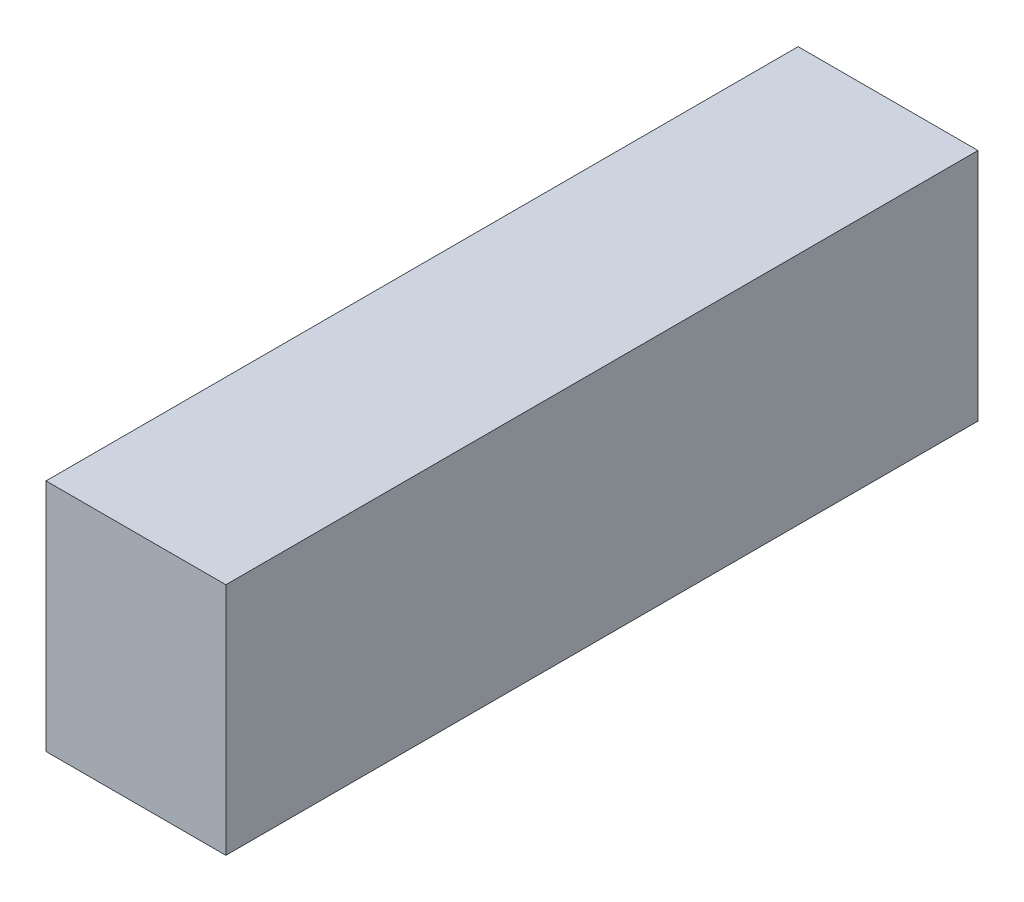
ISO-10303-21;
HEADER;
FILE_DESCRIPTION(('STEP AP214'),'2;1');
FILE_NAME('part.step','',(''),(''),'','','');
FILE_SCHEMA(('AUTOMOTIVE_DESIGN { 1 0 10303 214 1 1 1 1 }'));
ENDSEC;
DATA;
#1=APPLICATION_CONTEXT('core data for automotive mechanical design processes');
#2=APPLICATION_PROTOCOL_DEFINITION('international standard','automotive_design',2000,#1);
#3=PRODUCT_CONTEXT('',#1,'mechanical');
#4=PRODUCT('Part','Part','',(#3));
#5=PRODUCT_RELATED_PRODUCT_CATEGORY('part','',(#4));
#6=PRODUCT_DEFINITION_FORMATION('','',#4);
#7=PRODUCT_DEFINITION_CONTEXT('part definition',#1,'design');
#8=PRODUCT_DEFINITION('design','',#6,#7);
#9=PRODUCT_DEFINITION_SHAPE('','',#8);
#10=(LENGTH_UNIT() NAMED_UNIT(*) SI_UNIT(.MILLI.,.METRE.));
#11=(NAMED_UNIT(*) PLANE_ANGLE_UNIT() SI_UNIT($,.RADIAN.));
#12=(NAMED_UNIT(*) SI_UNIT($,.STERADIAN.) SOLID_ANGLE_UNIT());
#13=UNCERTAINTY_MEASURE_WITH_UNIT(LENGTH_MEASURE(1.E-05),#10,'distance_accuracy_value','');
#14=(GEOMETRIC_REPRESENTATION_CONTEXT(3) GLOBAL_UNCERTAINTY_ASSIGNED_CONTEXT((#13)) GLOBAL_UNIT_ASSIGNED_CONTEXT((#10,
#11,#12)) REPRESENTATION_CONTEXT('',''));
#15=CARTESIAN_POINT('',(0.,0.,0.));
#16=DIRECTION('',(0.,0.,1.));
#17=DIRECTION('',(1.,0.,0.));
#18=AXIS2_PLACEMENT_3D('',#15,#16,#17);
#19=CARTESIAN_POINT('',(33.,0.,0.));
#20=DIRECTION('',(0.,0.,-1.));
#21=DIRECTION('',(0.,1.,0.));
#22=AXIS2_PLACEMENT_3D('',#19,#20,#21);
#23=PLANE('',#22);
#24=DIRECTION('',(0.,-1.,0.));
#25=VECTOR('',#24,1.);
#26=CARTESIAN_POINT('',(0.,0.,0.));
#27=LINE('',#26,#25);
#28=CARTESIAN_POINT('',(0.,0.,0.));
#29=VERTEX_POINT('',#28);
#30=CARTESIAN_POINT('',(0.,-43.,0.));
#31=VERTEX_POINT('',#30);
#32=EDGE_CURVE('E96',#29,#31,#27,.T.);
#33=ORIENTED_EDGE('',*,*,#32,.T.);
#34=DIRECTION('',(-1.,0.,0.));
#35=VECTOR('',#34,1.);
#36=CARTESIAN_POINT('',(33.,-43.,0.));
#37=LINE('',#36,#35);
#38=CARTESIAN_POINT('',(33.,-43.,0.));
#39=VERTEX_POINT('',#38);
#40=EDGE_CURVE('E11',#39,#31,#37,.T.);
#41=ORIENTED_EDGE('',*,*,#40,.F.);
#42=DIRECTION('',(0.,-1.,0.));
#43=VECTOR('',#42,1.);
#44=CARTESIAN_POINT('',(33.,0.,0.));
#45=LINE('',#44,#43);
#46=CARTESIAN_POINT('',(33.,0.,0.));
#47=VERTEX_POINT('',#46);
#48=EDGE_CURVE('E84',#47,#39,#45,.T.);
#49=ORIENTED_EDGE('',*,*,#48,.F.);
#50=DIRECTION('',(-1.,0.,0.));
#51=VECTOR('',#50,1.);
#52=CARTESIAN_POINT('',(33.,0.,0.));
#53=LINE('',#52,#51);
#54=EDGE_CURVE('E92',#47,#29,#53,.T.);
#55=ORIENTED_EDGE('',*,*,#54,.T.);
#56=EDGE_LOOP('',(#33,#41,#49,#55));
#57=FACE_BOUND('',#56,.T.);
#58=ADVANCED_FACE('F33',(#57),#23,.F.);
#59=CARTESIAN_POINT('',(33.,-43.,0.));
#60=DIRECTION('',(0.,1.,0.));
#61=DIRECTION('',(0.,0.,1.));
#62=AXIS2_PLACEMENT_3D('',#59,#60,#61);
#63=PLANE('',#62);
#64=DIRECTION('',(0.,0.,-1.));
#65=VECTOR('',#64,1.);
#66=CARTESIAN_POINT('',(0.,-43.,0.));
#67=LINE('',#66,#65);
#68=CARTESIAN_POINT('',(0.,-43.,-138.));
#69=VERTEX_POINT('',#68);
#70=EDGE_CURVE('E88',#31,#69,#67,.T.);
#71=ORIENTED_EDGE('',*,*,#70,.T.);
#72=DIRECTION('',(-1.,0.,0.));
#73=VECTOR('',#72,1.);
#74=CARTESIAN_POINT('',(33.,-43.,-138.));
#75=LINE('',#74,#73);
#76=CARTESIAN_POINT('',(33.,-43.,-138.));
#77=VERTEX_POINT('',#76);
#78=EDGE_CURVE('E41',#77,#69,#75,.T.);
#79=ORIENTED_EDGE('',*,*,#78,.F.);
#80=DIRECTION('',(0.,0.,-1.));
#81=VECTOR('',#80,1.);
#82=CARTESIAN_POINT('',(33.,-43.,0.));
#83=LINE('',#82,#81);
#84=EDGE_CURVE('E79',#39,#77,#83,.T.);
#85=ORIENTED_EDGE('',*,*,#84,.F.);
#86=ORIENTED_EDGE('',*,*,#40,.T.);
#87=EDGE_LOOP('',(#71,#79,#85,#86));
#88=FACE_BOUND('',#87,.T.);
#89=ADVANCED_FACE('F87',(#88),#63,.F.);
#90=CARTESIAN_POINT('',(33.,0.,-138.));
#91=DIRECTION('',(0.,0.,1.));
#92=DIRECTION('',(1.,0.,0.));
#93=AXIS2_PLACEMENT_3D('',#90,#91,#92);
#94=PLANE('',#93);
#95=DIRECTION('',(0.,1.,0.));
#96=VECTOR('',#95,1.);
#97=CARTESIAN_POINT('',(0.,0.,-138.));
#98=LINE('',#97,#96);
#99=CARTESIAN_POINT('',(0.,0.,-138.));
#100=VERTEX_POINT('',#99);
#101=EDGE_CURVE('E66',#69,#100,#98,.T.);
#102=ORIENTED_EDGE('',*,*,#101,.T.);
#103=DIRECTION('',(-1.,0.,0.));
#104=VECTOR('',#103,1.);
#105=CARTESIAN_POINT('',(33.,0.,-138.));
#106=LINE('',#105,#104);
#107=CARTESIAN_POINT('',(33.,0.,-138.));
#108=VERTEX_POINT('',#107);
#109=EDGE_CURVE('E89',#108,#100,#106,.T.);
#110=ORIENTED_EDGE('',*,*,#109,.F.);
#111=DIRECTION('',(0.,1.,0.));
#112=VECTOR('',#111,1.);
#113=CARTESIAN_POINT('',(33.,0.,-138.));
#114=LINE('',#113,#112);
#115=EDGE_CURVE('E82',#77,#108,#114,.T.);
#116=ORIENTED_EDGE('',*,*,#115,.F.);
#117=ORIENTED_EDGE('',*,*,#78,.T.);
#118=EDGE_LOOP('',(#102,#110,#116,#117));
#119=FACE_BOUND('',#118,.T.);
#120=ADVANCED_FACE('F90',(#119),#94,.F.);
#121=CARTESIAN_POINT('',(33.,0.,0.));
#122=DIRECTION('',(0.,-1.,0.));
#123=DIRECTION('',(0.,0.,-1.));
#124=AXIS2_PLACEMENT_3D('',#121,#122,#123);
#125=PLANE('',#124);
#126=DIRECTION('',(0.,0.,1.));
#127=VECTOR('',#126,1.);
#128=CARTESIAN_POINT('',(0.,0.,0.));
#129=LINE('',#128,#127);
#130=EDGE_CURVE('E72',#100,#29,#129,.T.);
#131=ORIENTED_EDGE('',*,*,#130,.T.);
#132=ORIENTED_EDGE('',*,*,#54,.F.);
#133=DIRECTION('',(0.,0.,1.));
#134=VECTOR('',#133,1.);
#135=CARTESIAN_POINT('',(33.,0.,0.));
#136=LINE('',#135,#134);
#137=EDGE_CURVE('E49',#108,#47,#136,.T.);
#138=ORIENTED_EDGE('',*,*,#137,.F.);
#139=ORIENTED_EDGE('',*,*,#109,.T.);
#140=EDGE_LOOP('',(#131,#132,#138,#139));
#141=FACE_BOUND('',#140,.T.);
#142=ADVANCED_FACE('F103',(#141),#125,.F.);
#143=CARTESIAN_POINT('',(33.,0.,0.));
#144=DIRECTION('',(1.,0.,0.));
#145=DIRECTION('',(0.,0.,-1.));
#146=AXIS2_PLACEMENT_3D('',#143,#144,#145);
#147=PLANE('',#146);
#148=ORIENTED_EDGE('',*,*,#48,.T.);
#149=ORIENTED_EDGE('',*,*,#84,.T.);
#150=ORIENTED_EDGE('',*,*,#115,.T.);
#151=ORIENTED_EDGE('',*,*,#137,.T.);
#152=EDGE_LOOP('',(#148,#149,#150,#151));
#153=FACE_BOUND('',#152,.T.);
#154=ADVANCED_FACE('F80',(#153),#147,.T.);
#155=CARTESIAN_POINT('',(0.,0.,0.));
#156=DIRECTION('',(1.,0.,0.));
#157=DIRECTION('',(0.,0.,-1.));
#158=AXIS2_PLACEMENT_3D('',#155,#156,#157);
#159=PLANE('',#158);
#160=ORIENTED_EDGE('',*,*,#32,.F.);
#161=ORIENTED_EDGE('',*,*,#130,.F.);
#162=ORIENTED_EDGE('',*,*,#101,.F.);
#163=ORIENTED_EDGE('',*,*,#70,.F.);
#164=EDGE_LOOP('',(#160,#161,#162,#163));
#165=FACE_BOUND('',#164,.T.);
#166=ADVANCED_FACE('F106',(#165),#159,.F.);
#167=CLOSED_SHELL('',(#58,#89,#120,#142,#154,#166));
#168=MANIFOLD_SOLID_BREP('B2',#167);
#169=ADVANCED_BREP_SHAPE_REPRESENTATION('',(#18,#168),#14);
#170=SHAPE_DEFINITION_REPRESENTATION(#9,#169);
ENDSEC;
END-ISO-10303-21;
